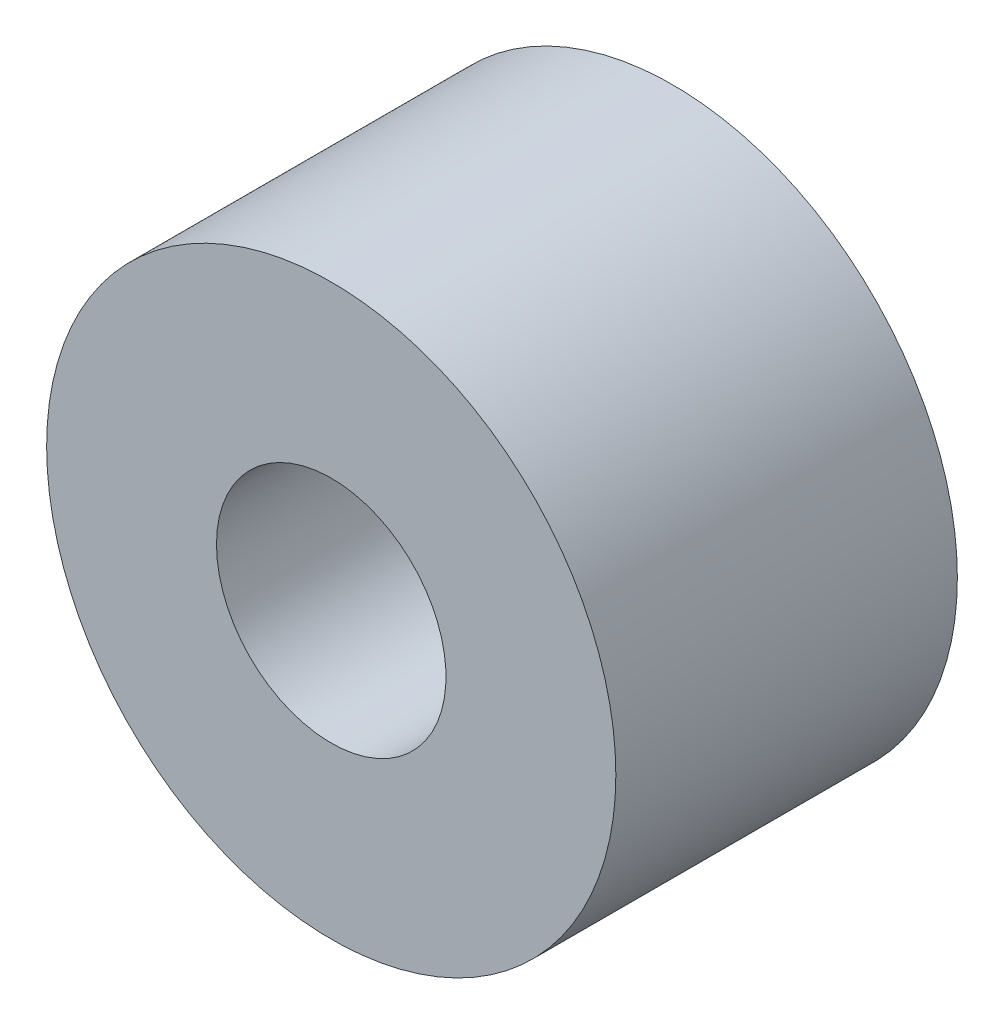
ISO-10303-21;
HEADER;
FILE_DESCRIPTION(('STEP AP214'),'2;1');
FILE_NAME('part.step','',(''),(''),'','','');
FILE_SCHEMA(('AUTOMOTIVE_DESIGN { 1 0 10303 214 1 1 1 1 }'));
ENDSEC;
DATA;
#1=APPLICATION_CONTEXT('core data for automotive mechanical design processes');
#2=APPLICATION_PROTOCOL_DEFINITION('international standard','automotive_design',2000,#1);
#3=PRODUCT_CONTEXT('',#1,'mechanical');
#4=PRODUCT('Part','Part','',(#3));
#5=PRODUCT_RELATED_PRODUCT_CATEGORY('part','',(#4));
#6=PRODUCT_DEFINITION_FORMATION('','',#4);
#7=PRODUCT_DEFINITION_CONTEXT('part definition',#1,'design');
#8=PRODUCT_DEFINITION('design','',#6,#7);
#9=PRODUCT_DEFINITION_SHAPE('','',#8);
#10=(LENGTH_UNIT() NAMED_UNIT(*) SI_UNIT(.MILLI.,.METRE.));
#11=(NAMED_UNIT(*) PLANE_ANGLE_UNIT() SI_UNIT($,.RADIAN.));
#12=(NAMED_UNIT(*) SI_UNIT($,.STERADIAN.) SOLID_ANGLE_UNIT());
#13=UNCERTAINTY_MEASURE_WITH_UNIT(LENGTH_MEASURE(1.E-05),#10,'distance_accuracy_value','');
#14=(GEOMETRIC_REPRESENTATION_CONTEXT(3) GLOBAL_UNCERTAINTY_ASSIGNED_CONTEXT((#13)) GLOBAL_UNIT_ASSIGNED_CONTEXT((#10,
#11,#12)) REPRESENTATION_CONTEXT('',''));
#15=CARTESIAN_POINT('',(0.,0.,0.));
#16=DIRECTION('',(0.,0.,1.));
#17=DIRECTION('',(1.,0.,0.));
#18=AXIS2_PLACEMENT_3D('',#15,#16,#17);
#19=CARTESIAN_POINT('',(0.,0.,4.7625));
#20=DIRECTION('',(0.,0.,1.));
#21=DIRECTION('',(1.,0.,0.));
#22=AXIS2_PLACEMENT_3D('',#19,#20,#21);
#23=PLANE('',#22);
#24=CARTESIAN_POINT('',(0.,0.,4.7625));
#25=DIRECTION('',(0.,0.,1.));
#26=DIRECTION('',(1.,0.,0.));
#27=AXIS2_PLACEMENT_3D('',#24,#25,#26);
#28=CIRCLE('',#27,7.9375);
#29=CARTESIAN_POINT('',(-7.9375,0.,4.7625));
#30=VERTEX_POINT('',#29);
#31=EDGE_CURVE('E10',#30,#30,#28,.T.);
#32=ORIENTED_EDGE('',*,*,#31,.T.);
#33=EDGE_LOOP('',(#32));
#34=FACE_BOUND('',#33,.T.);
#35=CARTESIAN_POINT('',(0.,0.,4.7625));
#36=DIRECTION('',(0.,0.,1.));
#37=DIRECTION('',(1.,0.,0.));
#38=AXIS2_PLACEMENT_3D('',#35,#36,#37);
#39=CIRCLE('',#38,3.2004);
#40=CARTESIAN_POINT('',(-3.2004,0.,4.7625));
#41=VERTEX_POINT('',#40);
#42=EDGE_CURVE('E44',#41,#41,#39,.T.);
#43=ORIENTED_EDGE('',*,*,#42,.F.);
#44=EDGE_LOOP('',(#43));
#45=FACE_BOUND('',#44,.T.);
#46=ADVANCED_FACE('F33',(#34,#45),#23,.T.);
#47=CARTESIAN_POINT('',(0.,0.,-4.7625));
#48=DIRECTION('',(0.,0.,1.));
#49=DIRECTION('',(1.,0.,0.));
#50=AXIS2_PLACEMENT_3D('',#47,#48,#49);
#51=PLANE('',#50);
#52=CARTESIAN_POINT('',(0.,0.,-4.7625));
#53=DIRECTION('',(0.,0.,1.));
#54=DIRECTION('',(1.,0.,0.));
#55=AXIS2_PLACEMENT_3D('',#52,#53,#54);
#56=CIRCLE('',#55,7.9375);
#57=CARTESIAN_POINT('',(-7.9375,0.,-4.7625));
#58=VERTEX_POINT('',#57);
#59=EDGE_CURVE('E37',#58,#58,#56,.T.);
#60=ORIENTED_EDGE('',*,*,#59,.F.);
#61=EDGE_LOOP('',(#60));
#62=FACE_BOUND('',#61,.T.);
#63=CARTESIAN_POINT('',(0.,0.,-4.7625));
#64=DIRECTION('',(0.,0.,1.));
#65=DIRECTION('',(1.,0.,0.));
#66=AXIS2_PLACEMENT_3D('',#63,#64,#65);
#67=CIRCLE('',#66,3.2004);
#68=CARTESIAN_POINT('',(-3.2004,0.,-4.7625));
#69=VERTEX_POINT('',#68);
#70=EDGE_CURVE('E46',#69,#69,#67,.T.);
#71=ORIENTED_EDGE('',*,*,#70,.T.);
#72=EDGE_LOOP('',(#71));
#73=FACE_BOUND('',#72,.T.);
#74=ADVANCED_FACE('F56',(#62,#73),#51,.F.);
#75=CARTESIAN_POINT('',(0.,0.,4.7625));
#76=DIRECTION('',(0.,0.,-1.));
#77=DIRECTION('',(-1.,0.,0.));
#78=AXIS2_PLACEMENT_3D('',#75,#76,#77);
#79=CYLINDRICAL_SURFACE('',#78,7.9375);
#80=CARTESIAN_POINT('',(-7.9375,0.,4.7625));
#81=CARTESIAN_POINT('',(-7.9375,0.,4.66328125));
#82=CARTESIAN_POINT('',(-7.9375,0.,4.5640625));
#83=CARTESIAN_POINT('',(-7.9375,0.,4.365625));
#84=CARTESIAN_POINT('',(-7.9375,0.,4.26640625));
#85=CARTESIAN_POINT('',(-7.9375,0.,4.06796875));
#86=CARTESIAN_POINT('',(-7.9375,0.,3.96875));
#87=CARTESIAN_POINT('',(-7.9375,0.,3.7703125));
#88=CARTESIAN_POINT('',(-7.9375,0.,3.67109375));
#89=CARTESIAN_POINT('',(-7.9375,0.,3.47265625));
#90=CARTESIAN_POINT('',(-7.9375,0.,3.3734375));
#91=CARTESIAN_POINT('',(-7.9375,0.,3.175));
#92=CARTESIAN_POINT('',(-7.9375,0.,3.07578125));
#93=CARTESIAN_POINT('',(-7.9375,0.,2.87734375));
#94=CARTESIAN_POINT('',(-7.9375,0.,2.778125));
#95=CARTESIAN_POINT('',(-7.9375,0.,2.5796875));
#96=CARTESIAN_POINT('',(-7.9375,0.,2.48046875));
#97=CARTESIAN_POINT('',(-7.9375,0.,2.28203125));
#98=CARTESIAN_POINT('',(-7.9375,0.,2.1828125));
#99=CARTESIAN_POINT('',(-7.9375,0.,1.984375));
#100=CARTESIAN_POINT('',(-7.9375,0.,1.88515625));
#101=CARTESIAN_POINT('',(-7.9375,0.,1.68671875));
#102=CARTESIAN_POINT('',(-7.9375,0.,1.5875));
#103=CARTESIAN_POINT('',(-7.9375,0.,1.3890625));
#104=CARTESIAN_POINT('',(-7.9375,0.,1.28984375));
#105=CARTESIAN_POINT('',(-7.9375,0.,1.09140625));
#106=CARTESIAN_POINT('',(-7.9375,0.,0.992187499999999));
#107=CARTESIAN_POINT('',(-7.9375,0.,0.79375));
#108=CARTESIAN_POINT('',(-7.9375,0.,0.69453125));
#109=CARTESIAN_POINT('',(-7.9375,0.,0.49609375));
#110=CARTESIAN_POINT('',(-7.9375,0.,0.396875));
#111=CARTESIAN_POINT('',(-7.9375,0.,0.1984375));
#112=CARTESIAN_POINT('',(-7.9375,0.,0.0992187500000001));
#113=CARTESIAN_POINT('',(-7.9375,0.,-0.0992187500000001));
#114=CARTESIAN_POINT('',(-7.9375,0.,-0.1984375));
#115=CARTESIAN_POINT('',(-7.9375,0.,-0.396875));
#116=CARTESIAN_POINT('',(-7.9375,0.,-0.49609375));
#117=CARTESIAN_POINT('',(-7.9375,0.,-0.69453125));
#118=CARTESIAN_POINT('',(-7.9375,0.,-0.793750000000001));
#119=CARTESIAN_POINT('',(-7.9375,0.,-0.992187500000001));
#120=CARTESIAN_POINT('',(-7.9375,0.,-1.09140625));
#121=CARTESIAN_POINT('',(-7.9375,0.,-1.28984375));
#122=CARTESIAN_POINT('',(-7.9375,0.,-1.3890625));
#123=CARTESIAN_POINT('',(-7.9375,0.,-1.5875));
#124=CARTESIAN_POINT('',(-7.9375,0.,-1.68671875));
#125=CARTESIAN_POINT('',(-7.9375,0.,-1.88515625));
#126=CARTESIAN_POINT('',(-7.9375,0.,-1.984375));
#127=CARTESIAN_POINT('',(-7.9375,0.,-2.1828125));
#128=CARTESIAN_POINT('',(-7.9375,0.,-2.28203125));
#129=CARTESIAN_POINT('',(-7.9375,0.,-2.48046875));
#130=CARTESIAN_POINT('',(-7.9375,0.,-2.5796875));
#131=CARTESIAN_POINT('',(-7.9375,0.,-2.778125));
#132=CARTESIAN_POINT('',(-7.9375,0.,-2.87734375));
#133=CARTESIAN_POINT('',(-7.9375,0.,-3.07578125));
#134=CARTESIAN_POINT('',(-7.9375,0.,-3.175));
#135=CARTESIAN_POINT('',(-7.9375,0.,-3.3734375));
#136=CARTESIAN_POINT('',(-7.9375,0.,-3.47265625));
#137=CARTESIAN_POINT('',(-7.9375,0.,-3.67109375));
#138=CARTESIAN_POINT('',(-7.9375,0.,-3.7703125));
#139=CARTESIAN_POINT('',(-7.9375,0.,-3.96875));
#140=CARTESIAN_POINT('',(-7.9375,0.,-4.06796875));
#141=CARTESIAN_POINT('',(-7.9375,0.,-4.26640625));
#142=CARTESIAN_POINT('',(-7.9375,0.,-4.365625));
#143=CARTESIAN_POINT('',(-7.9375,0.,-4.5640625));
#144=CARTESIAN_POINT('',(-7.9375,0.,-4.66328125));
#145=CARTESIAN_POINT('',(-7.9375,0.,-4.7625));
#146=B_SPLINE_CURVE_WITH_KNOTS('',3,(#80,#81,#82,#83,#84,#85,#86,#87,#88,#89,#90,#91,#92,#93,
#94,#95,#96,#97,#98,#99,#100,#101,#102,#103,#104,#105,#106,#107,#108,#109,#110,#111,#112,#113,
#114,#115,#116,#117,#118,#119,#120,#121,#122,#123,#124,#125,#126,#127,#128,#129,#130,#131,#132,
#133,#134,#135,#136,#137,#138,#139,#140,#141,#142,#143,#144,#145),.UNSPECIFIED.,.F.,.F.,(4,2,2,
2,2,2,2,2,2,2,2,2,2,2,2,2,2,2,2,2,2,2,2,2,2,2,2,2,2,2,2,2,4),(0.,0.29765625,0.5953125,
0.892968750000001,1.190625,1.48828125,1.7859375,2.08359375,2.38125,2.67890625,2.9765625,
3.27421875,3.571875,3.86953125,4.1671875,4.46484375,4.7625,5.06015625,5.3578125,5.65546875,
5.953125,6.25078125,6.5484375,6.84609375,7.14375,7.44140625,7.7390625,8.03671875,8.334375,
8.63203125,8.9296875,9.22734375,9.525),.UNSPECIFIED.);
#147=EDGE_CURVE('BSEAM35',#30,#58,#146,.T.);
#148=ORIENTED_EDGE('',*,*,#31,.F.);
#149=ORIENTED_EDGE('',*,*,#59,.T.);
#150=ORIENTED_EDGE('',*,*,#147,.T.);
#151=ORIENTED_EDGE('',*,*,#147,.F.);
#152=EDGE_LOOP('',(#148,#150,#149,#151));
#153=FACE_BOUND('',#152,.T.);
#154=ADVANCED_FACE('F35',(#153),#79,.T.);
#155=CARTESIAN_POINT('',(0.,0.,4.7625));
#156=DIRECTION('',(0.,0.,-1.));
#157=DIRECTION('',(-1.,0.,0.));
#158=AXIS2_PLACEMENT_3D('',#155,#156,#157);
#159=CYLINDRICAL_SURFACE('',#158,3.2004);
#160=CARTESIAN_POINT('',(-3.2004,0.,4.7625));
#161=CARTESIAN_POINT('',(-3.2004,0.,4.66328125));
#162=CARTESIAN_POINT('',(-3.2004,0.,4.5640625));
#163=CARTESIAN_POINT('',(-3.2004,0.,4.365625));
#164=CARTESIAN_POINT('',(-3.2004,0.,4.26640625));
#165=CARTESIAN_POINT('',(-3.2004,0.,4.06796875));
#166=CARTESIAN_POINT('',(-3.2004,0.,3.96875));
#167=CARTESIAN_POINT('',(-3.2004,0.,3.7703125));
#168=CARTESIAN_POINT('',(-3.2004,0.,3.67109375));
#169=CARTESIAN_POINT('',(-3.2004,0.,3.47265625));
#170=CARTESIAN_POINT('',(-3.2004,0.,3.3734375));
#171=CARTESIAN_POINT('',(-3.2004,0.,3.175));
#172=CARTESIAN_POINT('',(-3.2004,0.,3.07578125));
#173=CARTESIAN_POINT('',(-3.2004,0.,2.87734375));
#174=CARTESIAN_POINT('',(-3.2004,0.,2.778125));
#175=CARTESIAN_POINT('',(-3.2004,0.,2.5796875));
#176=CARTESIAN_POINT('',(-3.2004,0.,2.48046875));
#177=CARTESIAN_POINT('',(-3.2004,0.,2.28203125));
#178=CARTESIAN_POINT('',(-3.2004,0.,2.1828125));
#179=CARTESIAN_POINT('',(-3.2004,0.,1.984375));
#180=CARTESIAN_POINT('',(-3.2004,0.,1.88515625));
#181=CARTESIAN_POINT('',(-3.2004,0.,1.68671875));
#182=CARTESIAN_POINT('',(-3.2004,0.,1.5875));
#183=CARTESIAN_POINT('',(-3.2004,0.,1.3890625));
#184=CARTESIAN_POINT('',(-3.2004,0.,1.28984375));
#185=CARTESIAN_POINT('',(-3.2004,0.,1.09140625));
#186=CARTESIAN_POINT('',(-3.2004,0.,0.992187499999999));
#187=CARTESIAN_POINT('',(-3.2004,0.,0.79375));
#188=CARTESIAN_POINT('',(-3.2004,0.,0.69453125));
#189=CARTESIAN_POINT('',(-3.2004,0.,0.49609375));
#190=CARTESIAN_POINT('',(-3.2004,0.,0.396875));
#191=CARTESIAN_POINT('',(-3.2004,0.,0.1984375));
#192=CARTESIAN_POINT('',(-3.2004,0.,0.0992187500000001));
#193=CARTESIAN_POINT('',(-3.2004,0.,-0.0992187500000001));
#194=CARTESIAN_POINT('',(-3.2004,0.,-0.1984375));
#195=CARTESIAN_POINT('',(-3.2004,0.,-0.396875));
#196=CARTESIAN_POINT('',(-3.2004,0.,-0.49609375));
#197=CARTESIAN_POINT('',(-3.2004,0.,-0.69453125));
#198=CARTESIAN_POINT('',(-3.2004,0.,-0.793750000000001));
#199=CARTESIAN_POINT('',(-3.2004,0.,-0.992187500000001));
#200=CARTESIAN_POINT('',(-3.2004,0.,-1.09140625));
#201=CARTESIAN_POINT('',(-3.2004,0.,-1.28984375));
#202=CARTESIAN_POINT('',(-3.2004,0.,-1.3890625));
#203=CARTESIAN_POINT('',(-3.2004,0.,-1.5875));
#204=CARTESIAN_POINT('',(-3.2004,0.,-1.68671875));
#205=CARTESIAN_POINT('',(-3.2004,0.,-1.88515625));
#206=CARTESIAN_POINT('',(-3.2004,0.,-1.984375));
#207=CARTESIAN_POINT('',(-3.2004,0.,-2.1828125));
#208=CARTESIAN_POINT('',(-3.2004,0.,-2.28203125));
#209=CARTESIAN_POINT('',(-3.2004,0.,-2.48046875));
#210=CARTESIAN_POINT('',(-3.2004,0.,-2.5796875));
#211=CARTESIAN_POINT('',(-3.2004,0.,-2.778125));
#212=CARTESIAN_POINT('',(-3.2004,0.,-2.87734375));
#213=CARTESIAN_POINT('',(-3.2004,0.,-3.07578125));
#214=CARTESIAN_POINT('',(-3.2004,0.,-3.175));
#215=CARTESIAN_POINT('',(-3.2004,0.,-3.3734375));
#216=CARTESIAN_POINT('',(-3.2004,0.,-3.47265625));
#217=CARTESIAN_POINT('',(-3.2004,0.,-3.67109375));
#218=CARTESIAN_POINT('',(-3.2004,0.,-3.7703125));
#219=CARTESIAN_POINT('',(-3.2004,0.,-3.96875));
#220=CARTESIAN_POINT('',(-3.2004,0.,-4.06796875));
#221=CARTESIAN_POINT('',(-3.2004,0.,-4.26640625));
#222=CARTESIAN_POINT('',(-3.2004,0.,-4.365625));
#223=CARTESIAN_POINT('',(-3.2004,0.,-4.5640625));
#224=CARTESIAN_POINT('',(-3.2004,0.,-4.66328125));
#225=CARTESIAN_POINT('',(-3.2004,0.,-4.7625));
#226=B_SPLINE_CURVE_WITH_KNOTS('',3,(#160,#161,#162,#163,#164,#165,#166,#167,#168,#169,#170,
#171,#172,#173,#174,#175,#176,#177,#178,#179,#180,#181,#182,#183,#184,#185,#186,#187,#188,#189,
#190,#191,#192,#193,#194,#195,#196,#197,#198,#199,#200,#201,#202,#203,#204,#205,#206,#207,#208,
#209,#210,#211,#212,#213,#214,#215,#216,#217,#218,#219,#220,#221,#222,#223,#224,#225),
.UNSPECIFIED.,.F.,.F.,(4,2,2,2,2,2,2,2,2,2,2,2,2,2,2,2,2,2,2,2,2,2,2,2,2,2,2,2,2,2,2,2,4),(0.,
0.29765625,0.5953125,0.892968750000001,1.190625,1.48828125,1.7859375,2.08359375,2.38125,
2.67890625,2.9765625,3.27421875,3.571875,3.86953125,4.1671875,4.46484375,4.7625,5.06015625,
5.3578125,5.65546875,5.953125,6.25078125,6.5484375,6.84609375,7.14375,7.44140625,7.7390625,
8.03671875,8.334375,8.63203125,8.9296875,9.22734375,9.525),.UNSPECIFIED.);
#227=EDGE_CURVE('BSEAM52',#41,#69,#226,.T.);
#228=ORIENTED_EDGE('',*,*,#42,.T.);
#229=ORIENTED_EDGE('',*,*,#70,.F.);
#230=ORIENTED_EDGE('',*,*,#227,.T.);
#231=ORIENTED_EDGE('',*,*,#227,.F.);
#232=EDGE_LOOP('',(#228,#230,#229,#231));
#233=FACE_BOUND('',#232,.T.);
#234=ADVANCED_FACE('F52',(#233),#159,.F.);
#235=CLOSED_SHELL('',(#46,#74,#154,#234));
#236=MANIFOLD_SOLID_BREP('B2',#235);
#237=ADVANCED_BREP_SHAPE_REPRESENTATION('',(#18,#236),#14);
#238=SHAPE_DEFINITION_REPRESENTATION(#9,#237);
ENDSEC;
END-ISO-10303-21;
